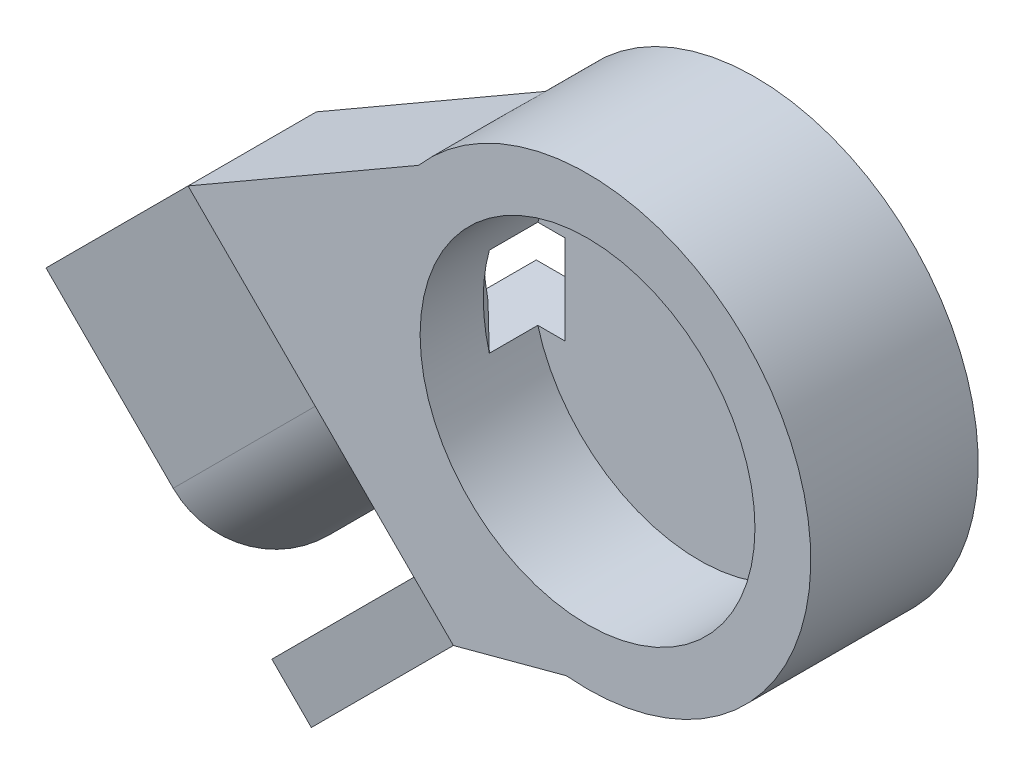
ISO-10303-21;
HEADER;
FILE_DESCRIPTION(('STEP AP214'),'2;1');
FILE_NAME('part.step','',(''),(''),'','','');
FILE_SCHEMA(('AUTOMOTIVE_DESIGN { 1 0 10303 214 1 1 1 1 }'));
ENDSEC;
DATA;
#1=APPLICATION_CONTEXT('core data for automotive mechanical design processes');
#2=APPLICATION_PROTOCOL_DEFINITION('international standard','automotive_design',2000,#1);
#3=PRODUCT_CONTEXT('',#1,'mechanical');
#4=PRODUCT('Part','Part','',(#3));
#5=PRODUCT_RELATED_PRODUCT_CATEGORY('part','',(#4));
#6=PRODUCT_DEFINITION_FORMATION('','',#4);
#7=PRODUCT_DEFINITION_CONTEXT('part definition',#1,'design');
#8=PRODUCT_DEFINITION('design','',#6,#7);
#9=PRODUCT_DEFINITION_SHAPE('','',#8);
#10=(LENGTH_UNIT() NAMED_UNIT(*) SI_UNIT(.MILLI.,.METRE.));
#11=(NAMED_UNIT(*) PLANE_ANGLE_UNIT() SI_UNIT($,.RADIAN.));
#12=(NAMED_UNIT(*) SI_UNIT($,.STERADIAN.) SOLID_ANGLE_UNIT());
#13=UNCERTAINTY_MEASURE_WITH_UNIT(LENGTH_MEASURE(1.E-05),#10,'distance_accuracy_value','');
#14=(GEOMETRIC_REPRESENTATION_CONTEXT(3) GLOBAL_UNCERTAINTY_ASSIGNED_CONTEXT((#13)) GLOBAL_UNIT_ASSIGNED_CONTEXT((#10,
#11,#12)) REPRESENTATION_CONTEXT('',''));
#15=CARTESIAN_POINT('',(0.,0.,0.));
#16=DIRECTION('',(0.,0.,1.));
#17=DIRECTION('',(1.,0.,0.));
#18=AXIS2_PLACEMENT_3D('',#15,#16,#17);
#19=CARTESIAN_POINT('',(189.291794181216,191.536858211483,43.2068234525343));
#20=DIRECTION('',(0.,0.,1.));
#21=DIRECTION('',(1.,0.,0.));
#22=AXIS2_PLACEMENT_3D('',#19,#20,#21);
#23=CYLINDRICAL_SURFACE('',#22,12.7);
#24=CARTESIAN_POINT('',(189.291794181216,191.536858211483,40.0318234525343));
#25=DIRECTION('',(0.,0.,-1.));
#26=DIRECTION('',(-1.,0.,0.));
#27=AXIS2_PLACEMENT_3D('',#24,#25,#26);
#28=CIRCLE('',#27,12.7);
#29=CARTESIAN_POINT('',(176.848386287877,194.076858211483,40.0318234525343));
#30=VERTEX_POINT('',#29);
#31=CARTESIAN_POINT('',(176.848386287877,188.996858211483,40.0318234525343));
#32=VERTEX_POINT('',#31);
#33=EDGE_CURVE('E210',#30,#32,#28,.T.);
#34=ORIENTED_EDGE('',*,*,#33,.F.);
#35=DIRECTION('',(0.,0.,-1.));
#36=VECTOR('',#35,1.);
#37=CARTESIAN_POINT('',(176.848386287877,194.076858211483,50.6073993524541));
#38=LINE('',#37,#36);
#39=CARTESIAN_POINT('',(176.848386287877,194.076858211483,43.4231944555987));
#40=VERTEX_POINT('',#39);
#41=EDGE_CURVE('E197',#40,#30,#38,.T.);
#42=ORIENTED_EDGE('',*,*,#41,.F.);
#43=CARTESIAN_POINT('',(189.291794181216,191.536858211483,43.4231944555987));
#44=DIRECTION('',(0.,0.,1.));
#45=DIRECTION('',(1.,0.,0.));
#46=AXIS2_PLACEMENT_3D('',#43,#44,#45);
#47=CIRCLE('',#46,12.7);
#48=CARTESIAN_POINT('',(180.783860187531,200.965806146386,43.4231944555987));
#49=VERTEX_POINT('',#48);
#50=EDGE_CURVE('E206',#49,#40,#47,.T.);
#51=ORIENTED_EDGE('',*,*,#50,.F.);
#52=CARTESIAN_POINT('',(189.291794181216,191.536858211483,222.509164481894));
#53=DIRECTION('',(-0.4988019518519,0.863950323522,0.069184183994363));
#54=DIRECTION('',(0.034592091997182,-0.0599152608792149,0.997603903703787));
#55=AXIS2_PLACEMENT_3D('',#52,#53,#54);
#56=ELLIPSE('',#55,183.567966936414,12.7);
#57=CARTESIAN_POINT('',(179.679400345909,199.836971750162,49.5568234525343));
#58=VERTEX_POINT('',#57);
#59=EDGE_CURVE('E222',#49,#58,#56,.T.);
#60=ORIENTED_EDGE('',*,*,#59,.T.);
#61=CARTESIAN_POINT('',(189.291794181216,191.536858211483,49.5568234525343));
#62=DIRECTION('',(0.,0.,1.));
#63=DIRECTION('',(1.,0.,0.));
#64=AXIS2_PLACEMENT_3D('',#61,#62,#63);
#65=CIRCLE('',#64,12.7);
#66=CARTESIAN_POINT('',(188.091179965308,178.893736543771,49.5568234525343));
#67=VERTEX_POINT('',#66);
#68=EDGE_CURVE('E506',#67,#58,#65,.T.);
#69=ORIENTED_EDGE('',*,*,#68,.F.);
#70=CARTESIAN_POINT('',(189.291794181216,191.536858211483,-39.2777485861119));
#71=DIRECTION('',(0.256527057434102,-0.957372011860212,-0.13278817609611));
#72=DIRECTION('',(0.0343681089381003,-0.128263528717053,0.991144439670157));
#73=AXIS2_PLACEMENT_3D('',#70,#71,#72);
#74=ELLIPSE('',#73,95.6410455612253,12.7);
#75=CARTESIAN_POINT('',(186.163914257989,179.228065939864,43.4231944555987));
#76=VERTEX_POINT('',#75);
#77=EDGE_CURVE('E218',#67,#76,#74,.T.);
#78=ORIENTED_EDGE('',*,*,#77,.T.);
#79=CARTESIAN_POINT('',(176.848386287877,188.996858211483,43.4231944555987));
#80=VERTEX_POINT('',#79);
#81=EDGE_CURVE('E219',#80,#76,#47,.T.);
#82=ORIENTED_EDGE('',*,*,#81,.F.);
#83=DIRECTION('',(0.,0.,-1.));
#84=VECTOR('',#83,1.);
#85=CARTESIAN_POINT('',(176.848386287877,188.996858211483,50.6073993524541));
#86=LINE('',#85,#84);
#87=EDGE_CURVE('E544',#80,#32,#86,.T.);
#88=ORIENTED_EDGE('',*,*,#87,.T.);
#89=EDGE_LOOP('',(#34,#42,#51,#60,#69,#78,#82,#88));
#90=FACE_BOUND('',#89,.T.);
#91=ADVANCED_FACE('F35',(#90),#23,.T.);
#92=CARTESIAN_POINT('',(189.291794181216,191.536858211483,43.2068234525343));
#93=DIRECTION('',(0.,0.,1.));
#94=DIRECTION('',(1.,0.,0.));
#95=AXIS2_PLACEMENT_3D('',#92,#93,#94);
#96=CYLINDRICAL_SURFACE('',#95,9.52499999999999);
#97=CARTESIAN_POINT('',(189.291794181216,191.536858211483,49.5568234525343));
#98=DIRECTION('',(0.,0.,1.));
#99=DIRECTION('',(1.,0.,0.));
#100=AXIS2_PLACEMENT_3D('',#97,#98,#99);
#101=CIRCLE('',#100,9.52499999999999);
#102=CARTESIAN_POINT('',(198.816794181216,191.536858211483,49.5568234525343));
#103=VERTEX_POINT('',#102);
#104=EDGE_CURVE('E226',#103,#103,#101,.T.);
#105=ORIENTED_EDGE('',*,*,#104,.T.);
#106=EDGE_LOOP('',(#105));
#107=FACE_BOUND('',#106,.T.);
#108=CARTESIAN_POINT('',(189.291794181216,191.536858211483,45.9631944555987));
#109=DIRECTION('',(0.,0.,1.));
#110=DIRECTION('',(1.,0.,0.));
#111=AXIS2_PLACEMENT_3D('',#108,#109,#110);
#112=CIRCLE('',#111,9.52499999999999);
#113=CARTESIAN_POINT('',(180.111705674017,188.996858211483,45.9631944555987));
#114=VERTEX_POINT('',#113);
#115=CARTESIAN_POINT('',(180.111705674017,194.076858211483,45.9631944555987));
#116=VERTEX_POINT('',#115);
#117=EDGE_CURVE('E370',#114,#116,#112,.F.);
#118=ORIENTED_EDGE('',*,*,#117,.T.);
#119=DIRECTION('',(0.,0.,1.));
#120=VECTOR('',#119,1.);
#121=CARTESIAN_POINT('',(180.111705674017,194.076858211483,43.2068234525343));
#122=LINE('',#121,#120);
#123=CARTESIAN_POINT('',(180.111705674017,194.076858211483,43.2068234525343));
#124=VERTEX_POINT('',#123);
#125=EDGE_CURVE('E531',#124,#116,#122,.T.);
#126=ORIENTED_EDGE('',*,*,#125,.F.);
#127=CARTESIAN_POINT('',(189.291794181216,191.536858211483,43.2068234525343));
#128=DIRECTION('',(0.,0.,1.));
#129=DIRECTION('',(1.,0.,0.));
#130=AXIS2_PLACEMENT_3D('',#127,#128,#129);
#131=CIRCLE('',#130,9.52499999999999);
#132=CARTESIAN_POINT('',(180.111705674017,188.996858211483,43.2068234525343));
#133=VERTEX_POINT('',#132);
#134=EDGE_CURVE('E224',#133,#124,#131,.T.);
#135=ORIENTED_EDGE('',*,*,#134,.F.);
#136=DIRECTION('',(0.,0.,1.));
#137=VECTOR('',#136,1.);
#138=CARTESIAN_POINT('',(180.111705674017,188.996858211483,43.2068234525343));
#139=LINE('',#138,#137);
#140=EDGE_CURVE('E200',#133,#114,#139,.T.);
#141=ORIENTED_EDGE('',*,*,#140,.T.);
#142=EDGE_LOOP('',(#118,#126,#135,#141));
#143=FACE_BOUND('',#142,.T.);
#144=ADVANCED_FACE('F388',(#107,#143),#96,.F.);
#145=CARTESIAN_POINT('',(189.291794181216,191.536858211483,40.0318234525343));
#146=DIRECTION('',(0.,0.,-1.));
#147=DIRECTION('',(-1.,0.,0.));
#148=AXIS2_PLACEMENT_3D('',#145,#146,#147);
#149=PLANE('',#148);
#150=DIRECTION('',(0.,1.,0.));
#151=VECTOR('',#150,1.);
#152=CARTESIAN_POINT('',(181.671794181216,0.,40.0318234525343));
#153=LINE('',#152,#151);
#154=CARTESIAN_POINT('',(181.671794181216,188.996858211483,40.0318234525343));
#155=VERTEX_POINT('',#154);
#156=CARTESIAN_POINT('',(181.671794181216,194.076858211483,40.0318234525343));
#157=VERTEX_POINT('',#156);
#158=EDGE_CURVE('E543',#155,#157,#153,.T.);
#159=ORIENTED_EDGE('',*,*,#158,.T.);
#160=DIRECTION('',(-1.,0.,0.));
#161=VECTOR('',#160,1.);
#162=CARTESIAN_POINT('',(0.,194.076858211483,40.0318234525343));
#163=LINE('',#162,#161);
#164=EDGE_CURVE('E212',#157,#30,#163,.T.);
#165=ORIENTED_EDGE('',*,*,#164,.T.);
#166=ORIENTED_EDGE('',*,*,#33,.T.);
#167=DIRECTION('',(-1.,0.,0.));
#168=VECTOR('',#167,1.);
#169=CARTESIAN_POINT('',(0.,188.996858211483,40.0318234525343));
#170=LINE('',#169,#168);
#171=EDGE_CURVE('E201',#155,#32,#170,.T.);
#172=ORIENTED_EDGE('',*,*,#171,.F.);
#173=EDGE_LOOP('',(#159,#165,#166,#172));
#174=FACE_BOUND('',#173,.T.);
#175=ADVANCED_FACE('F384',(#174),#149,.T.);
#176=CARTESIAN_POINT('',(189.291794181216,191.536858211483,43.2068234525343));
#177=DIRECTION('',(0.,0.,-1.));
#178=DIRECTION('',(-1.,0.,0.));
#179=AXIS2_PLACEMENT_3D('',#176,#177,#178);
#180=PLANE('',#179);
#181=DIRECTION('',(-1.,0.,0.));
#182=VECTOR('',#181,1.);
#183=CARTESIAN_POINT('',(189.291794181216,194.076858211483,43.2068234525343));
#184=LINE('',#183,#182);
#185=CARTESIAN_POINT('',(181.671794181216,194.076858211483,43.2068234525343));
#186=VERTEX_POINT('',#185);
#187=EDGE_CURVE('E368',#186,#124,#184,.T.);
#188=ORIENTED_EDGE('',*,*,#187,.F.);
#189=DIRECTION('',(0.,1.,0.));
#190=VECTOR('',#189,1.);
#191=CARTESIAN_POINT('',(181.671794181216,191.536858211483,43.2068234525343));
#192=LINE('',#191,#190);
#193=CARTESIAN_POINT('',(181.671794181216,188.996858211483,43.2068234525343));
#194=VERTEX_POINT('',#193);
#195=EDGE_CURVE('E307',#194,#186,#192,.T.);
#196=ORIENTED_EDGE('',*,*,#195,.F.);
#197=DIRECTION('',(-1.,0.,0.));
#198=VECTOR('',#197,1.);
#199=CARTESIAN_POINT('',(189.291794181216,188.996858211483,43.2068234525343));
#200=LINE('',#199,#198);
#201=EDGE_CURVE('E365',#194,#133,#200,.T.);
#202=ORIENTED_EDGE('',*,*,#201,.T.);
#203=ORIENTED_EDGE('',*,*,#134,.T.);
#204=EDGE_LOOP('',(#188,#196,#202,#203));
#205=FACE_BOUND('',#204,.T.);
#206=ADVANCED_FACE('F387',(#205),#180,.F.);
#207=CARTESIAN_POINT('',(167.727915489914,193.427952960691,43.4231944555987));
#208=DIRECTION('',(-0.683012701892217,-0.683012701892221,-0.258819045102523));
#209=DIRECTION('',(0.70710678118655,-0.707106781186546,0.));
#210=AXIS2_PLACEMENT_3D('',#207,#208,#209);
#211=PLANE('',#210);
#212=CARTESIAN_POINT('',(174.674741485381,185.900061636717,44.9566017048327));
#213=DIRECTION('',(0.683012701892218,0.683012701892221,0.258819045102521));
#214=DIRECTION('',(-0.707106781186549,0.707106781186546,0.));
#215=AXIS2_PLACEMENT_3D('',#212,#213,#214);
#216=CIRCLE('',#215,4.7625);
#217=CARTESIAN_POINT('',(173.803143492619,185.028463643955,49.5568234525343));
#218=VERTEX_POINT('',#217);
#219=CARTESIAN_POINT('',(178.042337530782,182.532465591316,44.9566017048327));
#220=VERTEX_POINT('',#219);
#221=EDGE_CURVE('E230',#218,#220,#216,.T.);
#222=ORIENTED_EDGE('',*,*,#221,.T.);
#223=DIRECTION('',(-0.18301270189222,-0.18301270189222,0.965925826289068));
#224=VECTOR('',#223,1.);
#225=CARTESIAN_POINT('',(173.912651098482,178.402779159016,66.7527433834745));
#226=LINE('',#225,#224);
#227=CARTESIAN_POINT('',(178.332870195036,182.82299825557,43.4231944555987));
#228=VERTEX_POINT('',#227);
#229=EDGE_CURVE('E255',#228,#220,#226,.T.);
#230=ORIENTED_EDGE('',*,*,#229,.F.);
#231=DIRECTION('',(0.707106781186549,-0.707106781186546,0.));
#232=VECTOR('',#231,1.);
#233=CARTESIAN_POINT('',(167.727915489914,193.427952960691,43.4231944555987));
#234=LINE('',#233,#232);
#235=CARTESIAN_POINT('',(180.577934225303,180.577934225303,43.4231944555987));
#236=VERTEX_POINT('',#235);
#237=EDGE_CURVE('E300',#228,#236,#234,.T.);
#238=ORIENTED_EDGE('',*,*,#237,.T.);
#239=DIRECTION('',(0.18301270189222,0.18301270189222,-0.965925826289068));
#240=VECTOR('',#239,1.);
#241=CARTESIAN_POINT('',(176.157715128749,176.157715128749,66.7527433834745));
#242=LINE('',#241,#240);
#243=CARTESIAN_POINT('',(179.415803568287,179.415803568287,49.5568234525343));
#244=VERTEX_POINT('',#243);
#245=EDGE_CURVE('E316',#244,#236,#242,.T.);
#246=ORIENTED_EDGE('',*,*,#245,.F.);
#247=DIRECTION('',(0.707106781186549,-0.707106781186546,0.));
#248=VECTOR('',#247,1.);
#249=CARTESIAN_POINT('',(166.565784832899,192.265822303676,49.5568234525343));
#250=LINE('',#249,#248);
#251=EDGE_CURVE('E294',#218,#244,#250,.T.);
#252=ORIENTED_EDGE('',*,*,#251,.F.);
#253=EDGE_LOOP('',(#222,#230,#238,#246,#252));
#254=FACE_BOUND('',#253,.T.);
#255=ADVANCED_FACE('F392',(#254),#211,.T.);
#256=CARTESIAN_POINT('',(176.157715128749,176.15771512875,66.7527433834745));
#257=DIRECTION('',(0.683012701892218,0.683012701892221,0.258819045102521));
#258=DIRECTION('',(-0.707106781186549,0.707106781186546,0.));
#259=AXIS2_PLACEMENT_3D('',#256,#257,#258);
#260=PLANE('',#259);
#261=CARTESIAN_POINT('',(182.160567818422,182.160567818422,35.0701859193552));
#262=VERTEX_POINT('',#261);
#263=EDGE_CURVE('E321',#236,#262,#242,.T.);
#264=ORIENTED_EDGE('',*,*,#263,.F.);
#265=CARTESIAN_POINT('',(182.82299825557,178.332870195035,43.4231944555988));
#266=VERTEX_POINT('',#265);
#267=EDGE_CURVE('E303',#236,#266,#234,.T.);
#268=ORIENTED_EDGE('',*,*,#267,.T.);
#269=DIRECTION('',(0.183012701892219,0.183012701892221,-0.965925826289068));
#270=VECTOR('',#269,1.);
#271=CARTESIAN_POINT('',(178.402779159017,173.912651098482,66.7527433834745));
#272=LINE('',#271,#270);
#273=CARTESIAN_POINT('',(184.40563184869,179.915503788155,35.0701859193552));
#274=VERTEX_POINT('',#273);
#275=EDGE_CURVE('E336',#266,#274,#272,.T.);
#276=ORIENTED_EDGE('',*,*,#275,.T.);
#277=DIRECTION('',(-0.707106781186549,0.707106781186546,0.));
#278=VECTOR('',#277,1.);
#279=CARTESIAN_POINT('',(182.160567818422,182.160567818423,35.0701859193552));
#280=LINE('',#279,#278);
#281=EDGE_CURVE('E327',#274,#262,#280,.T.);
#282=ORIENTED_EDGE('',*,*,#281,.T.);
#283=EDGE_LOOP('',(#264,#268,#276,#282));
#284=FACE_BOUND('',#283,.T.);
#285=ADVANCED_FACE('F461',(#284),#260,.T.);
#286=CARTESIAN_POINT('',(165.39138718797,160.901259127435,61.8222405742714));
#287=DIRECTION('',(0.707106781186549,-0.707106781186546,0.));
#288=DIRECTION('',(0.707106781186546,0.707106781186549,0.));
#289=AXIS2_PLACEMENT_3D('',#286,#287,#288);
#290=PLANE('',#289);
#291=CARTESIAN_POINT('',(181.660867598555,177.17073953802,49.5568234525343));
#292=VERTEX_POINT('',#291);
#293=EDGE_CURVE('E309',#292,#266,#272,.T.);
#294=ORIENTED_EDGE('',*,*,#293,.F.);
#295=DIRECTION('',(0.683012701892218,0.68301270189222,0.258819045102521));
#296=VECTOR('',#295,1.);
#297=CARTESIAN_POINT('',(168.649475627508,164.159347566973,44.6263206433313));
#298=LINE('',#297,#296);
#299=CARTESIAN_POINT('',(168.649475627508,164.159347566973,44.6263206433313));
#300=VERTEX_POINT('',#299);
#301=EDGE_CURVE('E308',#300,#292,#298,.T.);
#302=ORIENTED_EDGE('',*,*,#301,.F.);
#303=DIRECTION('',(0.183012701892219,0.183012701892221,-0.965925826289068));
#304=VECTOR('',#303,1.);
#305=CARTESIAN_POINT('',(165.39138718797,160.901259127435,61.8222405742714));
#306=LINE('',#305,#304);
#307=CARTESIAN_POINT('',(171.394239877643,166.904111817108,30.1396831101521));
#308=VERTEX_POINT('',#307);
#309=EDGE_CURVE('E348',#300,#308,#306,.T.);
#310=ORIENTED_EDGE('',*,*,#309,.T.);
#311=DIRECTION('',(0.683012701892218,0.68301270189222,0.258819045102521));
#312=VECTOR('',#311,1.);
#313=CARTESIAN_POINT('',(171.394239877643,166.904111817108,30.1396831101521));
#314=LINE('',#313,#312);
#315=EDGE_CURVE('E333',#308,#274,#314,.T.);
#316=ORIENTED_EDGE('',*,*,#315,.T.);
#317=ORIENTED_EDGE('',*,*,#275,.F.);
#318=EDGE_LOOP('',(#294,#302,#310,#316,#317));
#319=FACE_BOUND('',#318,.T.);
#320=ADVANCED_FACE('F464',(#319),#290,.T.);
#321=CARTESIAN_POINT('',(166.40441159724,166.404411597241,44.6263206433313));
#322=DIRECTION('',(-0.183012701892217,-0.183012701892223,0.965925826289068));
#323=DIRECTION('',(0.,-0.982520050848697,-0.186156787897389));
#324=AXIS2_PLACEMENT_3D('',#321,#322,#323);
#325=PLANE('',#324);
#326=DIRECTION('',(0.70710678118655,-0.707106781186546,0.));
#327=VECTOR('',#326,1.);
#328=CARTESIAN_POINT('',(179.415803568287,179.415803568288,49.5568234525343));
#329=LINE('',#328,#327);
#330=EDGE_CURVE('E320',#244,#292,#329,.T.);
#331=ORIENTED_EDGE('',*,*,#330,.F.);
#332=DIRECTION('',(0.683012701892218,0.68301270189222,0.258819045102521));
#333=VECTOR('',#332,1.);
#334=CARTESIAN_POINT('',(166.404411597241,166.40441159724,44.6263206433313));
#335=LINE('',#334,#333);
#336=CARTESIAN_POINT('',(166.404411597241,166.40441159724,44.6263206433313));
#337=VERTEX_POINT('',#336);
#338=EDGE_CURVE('E322',#337,#244,#335,.T.);
#339=ORIENTED_EDGE('',*,*,#338,.F.);
#340=DIRECTION('',(0.70710678118655,-0.707106781186546,0.));
#341=VECTOR('',#340,1.);
#342=CARTESIAN_POINT('',(166.40441159724,166.404411597241,44.6263206433313));
#343=LINE('',#342,#341);
#344=EDGE_CURVE('E335',#337,#300,#343,.T.);
#345=ORIENTED_EDGE('',*,*,#344,.T.);
#346=ORIENTED_EDGE('',*,*,#301,.T.);
#347=EDGE_LOOP('',(#331,#339,#345,#346));
#348=FACE_BOUND('',#347,.T.);
#349=ADVANCED_FACE('F466',(#348),#325,.T.);
#350=CARTESIAN_POINT('',(163.146323157703,163.146323157702,61.8222405742714));
#351=DIRECTION('',(0.707106781186549,-0.707106781186546,0.));
#352=DIRECTION('',(0.707106781186546,0.707106781186549,0.));
#353=AXIS2_PLACEMENT_3D('',#350,#351,#352);
#354=PLANE('',#353);
#355=ORIENTED_EDGE('',*,*,#245,.T.);
#356=ORIENTED_EDGE('',*,*,#263,.T.);
#357=DIRECTION('',(0.683012701892218,0.68301270189222,0.258819045102521));
#358=VECTOR('',#357,1.);
#359=CARTESIAN_POINT('',(169.149175847376,169.149175847375,30.1396831101522));
#360=LINE('',#359,#358);
#361=CARTESIAN_POINT('',(169.149175847376,169.149175847375,30.1396831101522));
#362=VERTEX_POINT('',#361);
#363=EDGE_CURVE('E330',#362,#262,#360,.T.);
#364=ORIENTED_EDGE('',*,*,#363,.F.);
#365=DIRECTION('',(0.18301270189222,0.18301270189222,-0.965925826289068));
#366=VECTOR('',#365,1.);
#367=CARTESIAN_POINT('',(163.146323157703,163.146323157702,61.8222405742714));
#368=LINE('',#367,#366);
#369=EDGE_CURVE('E343',#337,#362,#368,.T.);
#370=ORIENTED_EDGE('',*,*,#369,.F.);
#371=ORIENTED_EDGE('',*,*,#338,.T.);
#372=EDGE_LOOP('',(#355,#356,#364,#370,#371));
#373=FACE_BOUND('',#372,.T.);
#374=ADVANCED_FACE('F469',(#373),#354,.F.);
#375=CARTESIAN_POINT('',(169.149175847375,169.149175847376,30.1396831101522));
#376=DIRECTION('',(0.183012701892217,0.183012701892222,-0.965925826289068));
#377=DIRECTION('',(0.,0.982520050848697,0.186156787897388));
#378=AXIS2_PLACEMENT_3D('',#375,#376,#377);
#379=PLANE('',#378);
#380=ORIENTED_EDGE('',*,*,#281,.F.);
#381=ORIENTED_EDGE('',*,*,#315,.F.);
#382=DIRECTION('',(-0.707106781186549,0.707106781186546,0.));
#383=VECTOR('',#382,1.);
#384=CARTESIAN_POINT('',(169.149175847375,169.149175847376,30.1396831101522));
#385=LINE('',#384,#383);
#386=EDGE_CURVE('E345',#308,#362,#385,.T.);
#387=ORIENTED_EDGE('',*,*,#386,.T.);
#388=ORIENTED_EDGE('',*,*,#363,.T.);
#389=EDGE_LOOP('',(#380,#381,#387,#388));
#390=FACE_BOUND('',#389,.T.);
#391=ADVANCED_FACE('F459',(#390),#379,.T.);
#392=CARTESIAN_POINT('',(163.146323157702,163.146323157703,61.8222405742714));
#393=DIRECTION('',(0.683012701892218,0.683012701892221,0.258819045102521));
#394=DIRECTION('',(-0.707106781186549,0.707106781186546,0.));
#395=AXIS2_PLACEMENT_3D('',#392,#393,#394);
#396=PLANE('',#395);
#397=ORIENTED_EDGE('',*,*,#309,.F.);
#398=ORIENTED_EDGE('',*,*,#344,.F.);
#399=ORIENTED_EDGE('',*,*,#369,.T.);
#400=ORIENTED_EDGE('',*,*,#386,.F.);
#401=EDGE_LOOP('',(#397,#398,#399,#400));
#402=FACE_BOUND('',#401,.T.);
#403=ADVANCED_FACE('F455',(#402),#396,.F.);
#404=DIRECTION('',(-0.707106781186549,0.707106781186546,0.));
#405=VECTOR('',#404,1.);
#406=CARTESIAN_POINT('',(179.996868896795,179.996868896795,46.4900089540666));
#407=LINE('',#406,#405);
#408=CARTESIAN_POINT('',(174.384208821127,185.609528972463,46.4900089540666));
#409=VERTEX_POINT('',#408);
#410=CARTESIAN_POINT('',(167.146850161406,192.846887632184,46.4900089540666));
#411=VERTEX_POINT('',#410);
#412=EDGE_CURVE('E268',#409,#411,#407,.T.);
#413=ORIENTED_EDGE('',*,*,#412,.T.);
#414=DIRECTION('',(-0.183012701892221,-0.183012701892221,0.965925826289068));
#415=VECTOR('',#414,1.);
#416=CARTESIAN_POINT('',(167.727915489914,193.427952960691,43.4231944555987));
#417=LINE('',#416,#415);
#418=CARTESIAN_POINT('',(167.727915489914,193.427952960691,43.4231944555987));
#419=VERTEX_POINT('',#418);
#420=EDGE_CURVE('E337',#419,#411,#417,.T.);
#421=ORIENTED_EDGE('',*,*,#420,.F.);
#422=CARTESIAN_POINT('',(176.087806164768,185.068062285837,43.4231944555987));
#423=VERTEX_POINT('',#422);
#424=EDGE_CURVE('E295',#419,#423,#234,.T.);
#425=ORIENTED_EDGE('',*,*,#424,.T.);
#426=DIRECTION('',(-0.183012701892221,-0.183012701892218,0.965925826289068));
#427=VECTOR('',#426,1.);
#428=CARTESIAN_POINT('',(171.667587068215,180.647843189284,66.7527433834744));
#429=LINE('',#428,#427);
#430=CARTESIAN_POINT('',(175.797273500514,184.777529621583,44.9566017048327));
#431=VERTEX_POINT('',#430);
#432=EDGE_CURVE('E261',#423,#431,#429,.T.);
#433=ORIENTED_EDGE('',*,*,#432,.T.);
#434=CARTESIAN_POINT('',(174.674741485381,185.900061636717,44.9566017048327));
#435=DIRECTION('',(0.683012701892218,0.683012701892221,0.258819045102521));
#436=DIRECTION('',(-0.707106781186549,0.707106781186546,0.));
#437=AXIS2_PLACEMENT_3D('',#434,#435,#436);
#438=CIRCLE('',#437,1.58749999999999);
#439=EDGE_CURVE('E265',#409,#431,#438,.T.);
#440=ORIENTED_EDGE('',*,*,#439,.F.);
#441=EDGE_LOOP('',(#413,#421,#425,#433,#440));
#442=FACE_BOUND('',#441,.T.);
#443=ADVANCED_FACE('F448',(#442),#211,.T.);
#444=CARTESIAN_POINT('',(180.841531002925,200.999102407178,43.4231944555987));
#445=DIRECTION('',(-0.4988019518519,0.863950323522,0.069184183994363));
#446=DIRECTION('',(-0.866025403784435,-0.500000000000006,0.));
#447=AXIS2_PLACEMENT_3D('',#444,#445,#446);
#448=PLANE('',#447);
#449=ORIENTED_EDGE('',*,*,#59,.F.);
#450=DIRECTION('',(-0.866025403784435,-0.500000000000007,0.));
#451=VECTOR('',#450,1.);
#452=CARTESIAN_POINT('',(180.841531002925,200.999102407178,43.4231944555987));
#453=LINE('',#452,#451);
#454=EDGE_CURVE('E217',#49,#419,#453,.T.);
#455=ORIENTED_EDGE('',*,*,#454,.T.);
#456=ORIENTED_EDGE('',*,*,#420,.T.);
#457=DIRECTION('',(-0.18301270189222,-0.18301270189222,0.965925826289068));
#458=VECTOR('',#457,1.);
#459=CARTESIAN_POINT('',(163.307696393361,189.007733864138,66.7527433834744));
#460=LINE('',#459,#458);
#461=CARTESIAN_POINT('',(166.565784832899,192.265822303676,49.5568234525344));
#462=VERTEX_POINT('',#461);
#463=EDGE_CURVE('E234',#411,#462,#460,.T.);
#464=ORIENTED_EDGE('',*,*,#463,.T.);
#465=DIRECTION('',(-0.866025403784435,-0.500000000000007,0.));
#466=VECTOR('',#465,1.);
#467=CARTESIAN_POINT('',(179.679400345909,199.836971750162,49.5568234525343));
#468=LINE('',#467,#466);
#469=EDGE_CURVE('E500',#58,#462,#468,.T.);
#470=ORIENTED_EDGE('',*,*,#469,.F.);
#471=EDGE_LOOP('',(#449,#455,#456,#464,#470));
#472=FACE_BOUND('',#471,.T.);
#473=ADVANCED_FACE('F445',(#472),#448,.T.);
#474=CARTESIAN_POINT('',(182.82299825557,178.332870195036,43.4231944555987));
#475=DIRECTION('',(0.256527057434102,-0.957372011860212,-0.13278817609611));
#476=DIRECTION('',(0.965925826289069,0.25881904510252,0.));
#477=AXIS2_PLACEMENT_3D('',#474,#475,#476);
#478=PLANE('',#477);
#479=ORIENTED_EDGE('',*,*,#77,.F.);
#480=DIRECTION('',(0.965925826289069,0.25881904510252,0.));
#481=VECTOR('',#480,1.);
#482=CARTESIAN_POINT('',(181.660867598555,177.17073953802,49.5568234525343));
#483=LINE('',#482,#481);
#484=EDGE_CURVE('E354',#292,#67,#483,.T.);
#485=ORIENTED_EDGE('',*,*,#484,.F.);
#486=ORIENTED_EDGE('',*,*,#293,.T.);
#487=DIRECTION('',(0.965925826289069,0.25881904510252,0.));
#488=VECTOR('',#487,1.);
#489=CARTESIAN_POINT('',(182.82299825557,178.332870195036,43.4231944555987));
#490=LINE('',#489,#488);
#491=EDGE_CURVE('E299',#266,#76,#490,.T.);
#492=ORIENTED_EDGE('',*,*,#491,.T.);
#493=EDGE_LOOP('',(#479,#485,#486,#492));
#494=FACE_BOUND('',#493,.T.);
#495=ADVANCED_FACE('F441',(#494),#478,.T.);
#496=CARTESIAN_POINT('',(190.453924838232,192.698988868499,43.4231944555987));
#497=DIRECTION('',(0.,0.,1.));
#498=DIRECTION('',(1.,0.,0.));
#499=AXIS2_PLACEMENT_3D('',#496,#497,#498);
#500=PLANE('',#499);
#501=DIRECTION('',(-1.,0.,0.));
#502=VECTOR('',#501,1.);
#503=CARTESIAN_POINT('',(0.,194.076858211483,43.4231944555987));
#504=LINE('',#503,#502);
#505=CARTESIAN_POINT('',(177.497192661877,194.076858211483,43.4231944555987));
#506=VERTEX_POINT('',#505);
#507=EDGE_CURVE('E194',#506,#40,#504,.T.);
#508=ORIENTED_EDGE('',*,*,#507,.F.);
#509=CARTESIAN_POINT('',(189.291794181216,191.536858211483,43.4231944555987));
#510=DIRECTION('',(0.,0.,1.));
#511=DIRECTION('',(1.,0.,0.));
#512=AXIS2_PLACEMENT_3D('',#509,#510,#511);
#513=CIRCLE('',#512,12.065);
#514=CARTESIAN_POINT('',(177.497192661877,188.996858211483,43.4231944555987));
#515=VERTEX_POINT('',#514);
#516=EDGE_CURVE('E55',#506,#515,#513,.T.);
#517=ORIENTED_EDGE('',*,*,#516,.T.);
#518=DIRECTION('',(-1.,0.,0.));
#519=VECTOR('',#518,1.);
#520=CARTESIAN_POINT('',(0.,188.996858211483,43.4231944555987));
#521=LINE('',#520,#519);
#522=EDGE_CURVE('E211',#515,#80,#521,.T.);
#523=ORIENTED_EDGE('',*,*,#522,.T.);
#524=ORIENTED_EDGE('',*,*,#81,.T.);
#525=ORIENTED_EDGE('',*,*,#491,.F.);
#526=ORIENTED_EDGE('',*,*,#267,.F.);
#527=ORIENTED_EDGE('',*,*,#237,.F.);
#528=DIRECTION('',(-0.707106781186549,0.707106781186546,0.));
#529=VECTOR('',#528,1.);
#530=CARTESIAN_POINT('',(179.455402210169,181.700466240436,43.4231944555987));
#531=LINE('',#530,#529);
#532=EDGE_CURVE('E275',#228,#423,#531,.T.);
#533=ORIENTED_EDGE('',*,*,#532,.T.);
#534=ORIENTED_EDGE('',*,*,#424,.F.);
#535=ORIENTED_EDGE('',*,*,#454,.F.);
#536=ORIENTED_EDGE('',*,*,#50,.T.);
#537=EDGE_LOOP('',(#508,#517,#523,#524,#525,#526,#527,#533,#534,#535,#536));
#538=FACE_BOUND('',#537,.T.);
#539=ADVANCED_FACE('F215',(#538),#500,.F.);
#540=CARTESIAN_POINT('',(189.291794181216,191.536858211483,49.5568234525343));
#541=DIRECTION('',(0.,0.,1.));
#542=DIRECTION('',(1.,0.,0.));
#543=AXIS2_PLACEMENT_3D('',#540,#541,#542);
#544=PLANE('',#543);
#545=EDGE_CURVE('E351',#462,#218,#250,.T.);
#546=ORIENTED_EDGE('',*,*,#545,.T.);
#547=ORIENTED_EDGE('',*,*,#251,.T.);
#548=ORIENTED_EDGE('',*,*,#330,.T.);
#549=ORIENTED_EDGE('',*,*,#484,.T.);
#550=ORIENTED_EDGE('',*,*,#68,.T.);
#551=ORIENTED_EDGE('',*,*,#469,.T.);
#552=EDGE_LOOP('',(#546,#547,#548,#549,#550,#551));
#553=FACE_BOUND('',#552,.T.);
#554=ORIENTED_EDGE('',*,*,#104,.F.);
#555=EDGE_LOOP('',(#554));
#556=FACE_BOUND('',#555,.T.);
#557=ADVANCED_FACE('F407',(#553,#556),#544,.T.);
#558=CARTESIAN_POINT('',(176.157715128749,176.15771512875,66.7527433834745));
#559=DIRECTION('',(0.683012701892218,0.683012701892221,0.258819045102521));
#560=DIRECTION('',(-0.707106781186549,0.707106781186546,0.));
#561=AXIS2_PLACEMENT_3D('',#558,#559,#560);
#562=PLANE('',#561);
#563=ORIENTED_EDGE('',*,*,#532,.F.);
#564=CARTESIAN_POINT('',(179.915503788155,184.405631848689,35.0701859193552));
#565=VERTEX_POINT('',#564);
#566=EDGE_CURVE('E256',#565,#228,#226,.T.);
#567=ORIENTED_EDGE('',*,*,#566,.F.);
#568=DIRECTION('',(0.707106781186549,-0.707106781186546,0.));
#569=VECTOR('',#568,1.);
#570=CARTESIAN_POINT('',(182.160567818422,182.160567818423,35.0701859193552));
#571=LINE('',#570,#569);
#572=CARTESIAN_POINT('',(177.670439757888,186.650695878957,35.0701859193552));
#573=VERTEX_POINT('',#572);
#574=EDGE_CURVE('E259',#573,#565,#571,.T.);
#575=ORIENTED_EDGE('',*,*,#574,.F.);
#576=EDGE_CURVE('E262',#573,#423,#429,.T.);
#577=ORIENTED_EDGE('',*,*,#576,.T.);
#578=EDGE_LOOP('',(#563,#567,#575,#577));
#579=FACE_BOUND('',#578,.T.);
#580=ADVANCED_FACE('F403',(#579),#562,.T.);
#581=CARTESIAN_POINT('',(166.40441159724,166.404411597241,44.6263206433313));
#582=DIRECTION('',(0.183012701892218,0.183012701892221,-0.965925826289068));
#583=DIRECTION('',(0.,0.982520050848698,0.186156787897387));
#584=AXIS2_PLACEMENT_3D('',#581,#582,#583);
#585=PLANE('',#584);
#586=ORIENTED_EDGE('',*,*,#545,.F.);
#587=DIRECTION('',(0.683012701892218,0.68301270189222,0.258819045102521));
#588=VECTOR('',#587,1.);
#589=CARTESIAN_POINT('',(153.554392861852,179.254430332629,44.6263206433313));
#590=LINE('',#589,#588);
#591=CARTESIAN_POINT('',(153.554392861852,179.254430332629,44.6263206433313));
#592=VERTEX_POINT('',#591);
#593=EDGE_CURVE('E273',#592,#462,#590,.T.);
#594=ORIENTED_EDGE('',*,*,#593,.F.);
#595=DIRECTION('',(-0.707106781186549,0.707106781186546,0.));
#596=VECTOR('',#595,1.);
#597=CARTESIAN_POINT('',(166.40441159724,166.404411597241,44.6263206433313));
#598=LINE('',#597,#596);
#599=CARTESIAN_POINT('',(160.791751521572,172.017071672909,44.6263206433313));
#600=VERTEX_POINT('',#599);
#601=EDGE_CURVE('E231',#600,#592,#598,.T.);
#602=ORIENTED_EDGE('',*,*,#601,.F.);
#603=DIRECTION('',(0.683012701892218,0.68301270189222,0.258819045102521));
#604=VECTOR('',#603,1.);
#605=CARTESIAN_POINT('',(160.791751521572,172.017071672909,44.6263206433313));
#606=LINE('',#605,#604);
#607=EDGE_CURVE('E252',#600,#218,#606,.T.);
#608=ORIENTED_EDGE('',*,*,#607,.T.);
#609=EDGE_LOOP('',(#586,#594,#602,#608));
#610=FACE_BOUND('',#609,.T.);
#611=ADVANCED_FACE('F406',(#610),#585,.F.);
#612=CARTESIAN_POINT('',(150.296304422314,175.996341893091,61.8222405742714));
#613=DIRECTION('',(-0.707106781186549,0.707106781186546,0.));
#614=DIRECTION('',(-0.707106781186546,-0.707106781186549,0.));
#615=AXIS2_PLACEMENT_3D('',#612,#613,#614);
#616=PLANE('',#615);
#617=ORIENTED_EDGE('',*,*,#463,.F.);
#618=DIRECTION('',(0.683012701892218,0.68301270189222,0.258819045102521));
#619=VECTOR('',#618,1.);
#620=CARTESIAN_POINT('',(154.13545819036,179.835495661137,41.5595061448635));
#621=LINE('',#620,#619);
#622=CARTESIAN_POINT('',(154.13545819036,179.835495661137,41.5595061448635));
#623=VERTEX_POINT('',#622);
#624=EDGE_CURVE('E276',#623,#411,#621,.T.);
#625=ORIENTED_EDGE('',*,*,#624,.F.);
#626=DIRECTION('',(-0.18301270189222,-0.18301270189222,0.965925826289068));
#627=VECTOR('',#626,1.);
#628=CARTESIAN_POINT('',(150.296304422314,175.996341893091,61.8222405742714));
#629=LINE('',#628,#627);
#630=EDGE_CURVE('E249',#623,#592,#629,.T.);
#631=ORIENTED_EDGE('',*,*,#630,.T.);
#632=ORIENTED_EDGE('',*,*,#593,.T.);
#633=EDGE_LOOP('',(#617,#625,#631,#632));
#634=FACE_BOUND('',#633,.T.);
#635=ADVANCED_FACE('F409',(#634),#616,.T.);
#636=CARTESIAN_POINT('',(166.985476925748,166.985476925749,41.5595061448635));
#637=DIRECTION('',(0.183012701892218,0.183012701892221,-0.965925826289068));
#638=DIRECTION('',(0.,0.982520050848697,0.186156787897387));
#639=AXIS2_PLACEMENT_3D('',#636,#637,#638);
#640=PLANE('',#639);
#641=ORIENTED_EDGE('',*,*,#412,.F.);
#642=DIRECTION('',(0.683012701892218,0.68301270189222,0.258819045102521));
#643=VECTOR('',#642,1.);
#644=CARTESIAN_POINT('',(161.37281685008,172.598137001416,41.5595061448635));
#645=LINE('',#644,#643);
#646=CARTESIAN_POINT('',(161.37281685008,172.598137001416,41.5595061448635));
#647=VERTEX_POINT('',#646);
#648=EDGE_CURVE('E278',#647,#409,#645,.T.);
#649=ORIENTED_EDGE('',*,*,#648,.F.);
#650=DIRECTION('',(-0.707106781186549,0.707106781186546,0.));
#651=VECTOR('',#650,1.);
#652=CARTESIAN_POINT('',(166.985476925748,166.985476925749,41.5595061448635));
#653=LINE('',#652,#651);
#654=EDGE_CURVE('E246',#647,#623,#653,.T.);
#655=ORIENTED_EDGE('',*,*,#654,.T.);
#656=ORIENTED_EDGE('',*,*,#624,.T.);
#657=EDGE_LOOP('',(#641,#649,#655,#656));
#658=FACE_BOUND('',#657,.T.);
#659=ADVANCED_FACE('F412',(#658),#640,.T.);
#660=CARTESIAN_POINT('',(161.663349514334,172.88866966567,40.0260988956296));
#661=DIRECTION('',(0.683012701892218,0.68301270189222,0.258819045102521));
#662=DIRECTION('',(-0.707106781186549,0.707106781186546,0.));
#663=AXIS2_PLACEMENT_3D('',#660,#661,#662);
#664=CYLINDRICAL_SURFACE('',#663,1.58749999999999);
#665=ORIENTED_EDGE('',*,*,#439,.T.);
#666=DIRECTION('',(0.683012701892218,0.68301270189222,0.258819045102521));
#667=VECTOR('',#666,1.);
#668=CARTESIAN_POINT('',(162.785881529468,171.766137650537,40.0260988956296));
#669=LINE('',#668,#667);
#670=CARTESIAN_POINT('',(162.785881529468,171.766137650537,40.0260988956296));
#671=VERTEX_POINT('',#670);
#672=EDGE_CURVE('E280',#671,#431,#669,.T.);
#673=ORIENTED_EDGE('',*,*,#672,.F.);
#674=CARTESIAN_POINT('',(161.663349514334,172.88866966567,40.0260988956296));
#675=DIRECTION('',(0.683012701892218,0.683012701892221,0.258819045102521));
#676=DIRECTION('',(-0.707106781186549,0.707106781186546,0.));
#677=AXIS2_PLACEMENT_3D('',#674,#675,#676);
#678=CIRCLE('',#677,1.58749999999999);
#679=EDGE_CURVE('E244',#647,#671,#678,.T.);
#680=ORIENTED_EDGE('',*,*,#679,.F.);
#681=ORIENTED_EDGE('',*,*,#648,.T.);
#682=EDGE_LOOP('',(#665,#673,#680,#681));
#683=FACE_BOUND('',#682,.T.);
#684=ADVANCED_FACE('F416',(#683),#664,.F.);
#685=CARTESIAN_POINT('',(158.656195097168,167.636451218237,61.8222405742714));
#686=DIRECTION('',(-0.707106781186548,0.707106781186547,0.));
#687=DIRECTION('',(-0.707106781186547,-0.707106781186548,0.));
#688=AXIS2_PLACEMENT_3D('',#685,#686,#687);
#689=PLANE('',#688);
#690=ORIENTED_EDGE('',*,*,#576,.F.);
#691=DIRECTION('',(0.683012701892218,0.68301270189222,0.258819045102521));
#692=VECTOR('',#691,1.);
#693=CARTESIAN_POINT('',(164.659047786841,173.63930390791,30.1396831101522));
#694=LINE('',#693,#692);
#695=CARTESIAN_POINT('',(164.659047786841,173.63930390791,30.1396831101522));
#696=VERTEX_POINT('',#695);
#697=EDGE_CURVE('E282',#696,#573,#694,.T.);
#698=ORIENTED_EDGE('',*,*,#697,.F.);
#699=DIRECTION('',(-0.183012701892221,-0.183012701892218,0.965925826289068));
#700=VECTOR('',#699,1.);
#701=CARTESIAN_POINT('',(158.656195097168,167.636451218237,61.8222405742714));
#702=LINE('',#701,#700);
#703=EDGE_CURVE('E241',#696,#671,#702,.T.);
#704=ORIENTED_EDGE('',*,*,#703,.T.);
#705=ORIENTED_EDGE('',*,*,#672,.T.);
#706=ORIENTED_EDGE('',*,*,#432,.F.);
#707=EDGE_LOOP('',(#690,#698,#704,#705,#706));
#708=FACE_BOUND('',#707,.T.);
#709=ADVANCED_FACE('F420',(#708),#689,.T.);
#710=CARTESIAN_POINT('',(169.149175847375,169.149175847376,30.1396831101522));
#711=DIRECTION('',(-0.18301270189222,-0.18301270189222,0.965925826289068));
#712=DIRECTION('',(0.982520050848698,0.,0.186156787897386));
#713=AXIS2_PLACEMENT_3D('',#710,#711,#712);
#714=PLANE('',#713);
#715=ORIENTED_EDGE('',*,*,#574,.T.);
#716=DIRECTION('',(0.683012701892218,0.68301270189222,0.258819045102521));
#717=VECTOR('',#716,1.);
#718=CARTESIAN_POINT('',(166.904111817108,171.394239877643,30.1396831101522));
#719=LINE('',#718,#717);
#720=CARTESIAN_POINT('',(166.904111817108,171.394239877643,30.1396831101522));
#721=VERTEX_POINT('',#720);
#722=EDGE_CURVE('E284',#721,#565,#719,.T.);
#723=ORIENTED_EDGE('',*,*,#722,.F.);
#724=DIRECTION('',(0.707106781186549,-0.707106781186546,0.));
#725=VECTOR('',#724,1.);
#726=CARTESIAN_POINT('',(169.149175847375,169.149175847376,30.1396831101522));
#727=LINE('',#726,#725);
#728=EDGE_CURVE('E239',#696,#721,#727,.T.);
#729=ORIENTED_EDGE('',*,*,#728,.F.);
#730=ORIENTED_EDGE('',*,*,#697,.T.);
#731=EDGE_LOOP('',(#715,#723,#729,#730));
#732=FACE_BOUND('',#731,.T.);
#733=ADVANCED_FACE('F424',(#732),#714,.F.);
#734=CARTESIAN_POINT('',(160.901259127435,165.39138718797,61.8222405742714));
#735=DIRECTION('',(-0.707106781186549,0.707106781186546,0.));
#736=DIRECTION('',(-0.707106781186546,-0.707106781186549,0.));
#737=AXIS2_PLACEMENT_3D('',#734,#735,#736);
#738=PLANE('',#737);
#739=ORIENTED_EDGE('',*,*,#566,.T.);
#740=ORIENTED_EDGE('',*,*,#229,.T.);
#741=DIRECTION('',(0.683012701892218,0.68301270189222,0.258819045102521));
#742=VECTOR('',#741,1.);
#743=CARTESIAN_POINT('',(165.030945559735,169.521073620269,40.0260988956296));
#744=LINE('',#743,#742);
#745=CARTESIAN_POINT('',(165.030945559735,169.521073620269,40.0260988956296));
#746=VERTEX_POINT('',#745);
#747=EDGE_CURVE('E287',#746,#220,#744,.T.);
#748=ORIENTED_EDGE('',*,*,#747,.F.);
#749=DIRECTION('',(-0.18301270189222,-0.18301270189222,0.965925826289068));
#750=VECTOR('',#749,1.);
#751=CARTESIAN_POINT('',(160.901259127435,165.39138718797,61.8222405742714));
#752=LINE('',#751,#750);
#753=EDGE_CURVE('E237',#721,#746,#752,.T.);
#754=ORIENTED_EDGE('',*,*,#753,.F.);
#755=ORIENTED_EDGE('',*,*,#722,.T.);
#756=EDGE_LOOP('',(#739,#740,#748,#754,#755));
#757=FACE_BOUND('',#756,.T.);
#758=ADVANCED_FACE('F428',(#757),#738,.F.);
#759=CARTESIAN_POINT('',(161.663349514334,172.88866966567,40.0260988956297));
#760=DIRECTION('',(0.683012701892218,0.68301270189222,0.258819045102521));
#761=DIRECTION('',(-0.707106781186549,0.707106781186546,0.));
#762=AXIS2_PLACEMENT_3D('',#759,#760,#761);
#763=CYLINDRICAL_SURFACE('',#762,4.7625);
#764=ORIENTED_EDGE('',*,*,#221,.F.);
#765=ORIENTED_EDGE('',*,*,#607,.F.);
#766=CARTESIAN_POINT('',(161.663349514334,172.88866966567,40.0260988956297));
#767=DIRECTION('',(0.683012701892218,0.683012701892221,0.258819045102521));
#768=DIRECTION('',(-0.707106781186549,0.707106781186546,0.));
#769=AXIS2_PLACEMENT_3D('',#766,#767,#768);
#770=CIRCLE('',#769,4.7625);
#771=EDGE_CURVE('E233',#600,#746,#770,.T.);
#772=ORIENTED_EDGE('',*,*,#771,.T.);
#773=ORIENTED_EDGE('',*,*,#747,.T.);
#774=EDGE_LOOP('',(#764,#765,#772,#773));
#775=FACE_BOUND('',#774,.T.);
#776=ADVANCED_FACE('F401',(#775),#763,.T.);
#777=CARTESIAN_POINT('',(163.146323157702,163.146323157703,61.8222405742714));
#778=DIRECTION('',(0.683012701892218,0.683012701892221,0.258819045102521));
#779=DIRECTION('',(-0.707106781186549,0.707106781186546,0.));
#780=AXIS2_PLACEMENT_3D('',#777,#778,#779);
#781=PLANE('',#780);
#782=ORIENTED_EDGE('',*,*,#601,.T.);
#783=ORIENTED_EDGE('',*,*,#630,.F.);
#784=ORIENTED_EDGE('',*,*,#654,.F.);
#785=ORIENTED_EDGE('',*,*,#679,.T.);
#786=ORIENTED_EDGE('',*,*,#703,.F.);
#787=ORIENTED_EDGE('',*,*,#728,.T.);
#788=ORIENTED_EDGE('',*,*,#753,.T.);
#789=ORIENTED_EDGE('',*,*,#771,.F.);
#790=EDGE_LOOP('',(#782,#783,#784,#785,#786,#787,#788,#789));
#791=FACE_BOUND('',#790,.T.);
#792=ADVANCED_FACE('F381',(#791),#781,.F.);
#793=CARTESIAN_POINT('',(0.,194.076858211483,50.6073993524541));
#794=DIRECTION('',(0.,-1.,0.));
#795=DIRECTION('',(0.,0.,-1.));
#796=AXIS2_PLACEMENT_3D('',#793,#794,#795);
#797=PLANE('',#796);
#798=ORIENTED_EDGE('',*,*,#125,.T.);
#799=CARTESIAN_POINT('',(180.111705674017,194.076858211483,45.9631944555987));
#800=CARTESIAN_POINT('',(179.892991172251,194.076858211483,45.7523921975905));
#801=CARTESIAN_POINT('',(179.674536712884,194.076858211483,45.5413205240518));
#802=CARTESIAN_POINT('',(179.23806973377,194.076858211483,45.1187220244693));
#803=CARTESIAN_POINT('',(179.020057212662,194.076858211483,44.907195199832));
#804=CARTESIAN_POINT('',(178.584394833431,194.076858211483,44.483768985882));
#805=CARTESIAN_POINT('',(178.366744974948,194.076858211483,44.2718695969414));
#806=CARTESIAN_POINT('',(177.931752175913,194.076858211483,43.8477546633613));
#807=CARTESIAN_POINT('',(177.714409236308,194.076858211483,43.6355391177514));
#808=CARTESIAN_POINT('',(177.497192661877,194.076858211483,43.4231944555987));
#809=B_SPLINE_CURVE_WITH_KNOTS('',3,(#799,#800,#801,#802,#803,#804,#805,#806,#807,#808),
.UNSPECIFIED.,.F.,.F.,(4,2,2,2,4),(0.,0.911296606038369,1.82259039990565,2.73388328413416,
3.64517897126069),.UNSPECIFIED.);
#810=EDGE_CURVE('E48',#116,#506,#809,.T.);
#811=ORIENTED_EDGE('',*,*,#810,.T.);
#812=ORIENTED_EDGE('',*,*,#507,.T.);
#813=ORIENTED_EDGE('',*,*,#41,.T.);
#814=ORIENTED_EDGE('',*,*,#164,.F.);
#815=DIRECTION('',(0.,0.,-1.));
#816=VECTOR('',#815,1.);
#817=CARTESIAN_POINT('',(181.671794181216,194.076858211483,50.6073993524541));
#818=LINE('',#817,#816);
#819=EDGE_CURVE('E538',#186,#157,#818,.T.);
#820=ORIENTED_EDGE('',*,*,#819,.F.);
#821=ORIENTED_EDGE('',*,*,#187,.T.);
#822=EDGE_LOOP('',(#798,#811,#812,#813,#814,#820,#821));
#823=FACE_BOUND('',#822,.T.);
#824=ADVANCED_FACE('F196',(#823),#797,.T.);
#825=CARTESIAN_POINT('',(0.,188.996858211483,50.6073993524541));
#826=DIRECTION('',(0.,-1.,0.));
#827=DIRECTION('',(0.,0.,-1.));
#828=AXIS2_PLACEMENT_3D('',#825,#826,#827);
#829=PLANE('',#828);
#830=ORIENTED_EDGE('',*,*,#201,.F.);
#831=DIRECTION('',(0.,0.,-1.));
#832=VECTOR('',#831,1.);
#833=CARTESIAN_POINT('',(181.671794181216,188.996858211483,50.6073993524541));
#834=LINE('',#833,#832);
#835=EDGE_CURVE('E541',#194,#155,#834,.T.);
#836=ORIENTED_EDGE('',*,*,#835,.T.);
#837=ORIENTED_EDGE('',*,*,#171,.T.);
#838=ORIENTED_EDGE('',*,*,#87,.F.);
#839=ORIENTED_EDGE('',*,*,#522,.F.);
#840=CARTESIAN_POINT('',(177.497192661877,188.996858211483,43.4231944555987));
#841=CARTESIAN_POINT('',(177.714409236308,188.996858211483,43.6355391177514));
#842=CARTESIAN_POINT('',(177.931752175913,188.996858211483,43.8477546633613));
#843=CARTESIAN_POINT('',(178.366744974948,188.996858211483,44.2718695969414));
#844=CARTESIAN_POINT('',(178.584394833431,188.996858211483,44.483768985882));
#845=CARTESIAN_POINT('',(179.020057212662,188.996858211483,44.907195199832));
#846=CARTESIAN_POINT('',(179.23806973377,188.996858211483,45.1187220244693));
#847=CARTESIAN_POINT('',(179.674536712884,188.996858211483,45.5413205240518));
#848=CARTESIAN_POINT('',(179.892991172251,188.996858211483,45.7523921975905));
#849=CARTESIAN_POINT('',(180.111705674017,188.996858211483,45.9631944555988));
#850=B_SPLINE_CURVE_WITH_KNOTS('',3,(#840,#841,#842,#843,#844,#845,#846,#847,#848,#849),
.UNSPECIFIED.,.F.,.F.,(4,2,2,2,4),(0.,0.911295687126533,1.82258857135504,2.7338823652223,
3.6451789712607),.UNSPECIFIED.);
#851=EDGE_CURVE('E11',#515,#114,#850,.T.);
#852=ORIENTED_EDGE('',*,*,#851,.T.);
#853=ORIENTED_EDGE('',*,*,#140,.F.);
#854=EDGE_LOOP('',(#830,#836,#837,#838,#839,#852,#853));
#855=FACE_BOUND('',#854,.T.);
#856=ADVANCED_FACE('F380',(#855),#829,.F.);
#857=CARTESIAN_POINT('',(181.671794181216,0.,50.6073993524541));
#858=DIRECTION('',(-1.,0.,0.));
#859=DIRECTION('',(0.,0.,1.));
#860=AXIS2_PLACEMENT_3D('',#857,#858,#859);
#861=PLANE('',#860);
#862=ORIENTED_EDGE('',*,*,#195,.T.);
#863=ORIENTED_EDGE('',*,*,#819,.T.);
#864=ORIENTED_EDGE('',*,*,#158,.F.);
#865=ORIENTED_EDGE('',*,*,#835,.F.);
#866=EDGE_LOOP('',(#862,#863,#864,#865));
#867=FACE_BOUND('',#866,.T.);
#868=ADVANCED_FACE('F558',(#867),#861,.T.);
#869=CARTESIAN_POINT('',(189.291794181216,191.536858211483,45.9631944555987));
#870=DIRECTION('',(0.,0.,-1.));
#871=DIRECTION('',(-1.,0.,0.));
#872=AXIS2_PLACEMENT_3D('',#869,#870,#871);
#873=CONICAL_SURFACE('',#872,9.52499999999999,0.78539816339745);
#874=ORIENTED_EDGE('',*,*,#851,.F.);
#875=ORIENTED_EDGE('',*,*,#516,.F.);
#876=ORIENTED_EDGE('',*,*,#810,.F.);
#877=ORIENTED_EDGE('',*,*,#117,.F.);
#878=EDGE_LOOP('',(#874,#875,#876,#877));
#879=FACE_BOUND('',#878,.T.);
#880=ADVANCED_FACE('F37',(#879),#873,.F.);
#881=CLOSED_SHELL('',(#91,#144,#175,#206,#255,#285,#320,#349,#374,#391,#403,#443,#473,#495,#539,
#557,#580,#611,#635,#659,#684,#709,#733,#758,#776,#792,#824,#856,#868,#880));
#882=MANIFOLD_SOLID_BREP('B2',#881);
#883=ADVANCED_BREP_SHAPE_REPRESENTATION('',(#18,#882),#14);
#884=SHAPE_DEFINITION_REPRESENTATION(#9,#883);
ENDSEC;
END-ISO-10303-21;
